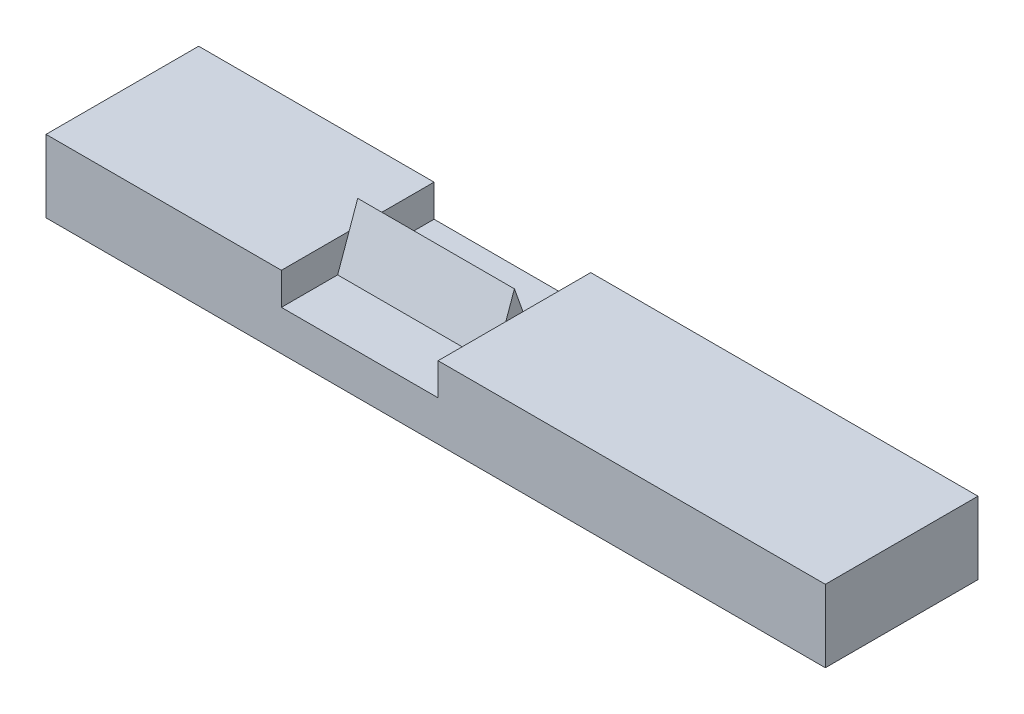
ISO-10303-21;
HEADER;
FILE_DESCRIPTION(('STEP AP214'),'2;1');
FILE_NAME('part.step','',(''),(''),'','','');
FILE_SCHEMA(('AUTOMOTIVE_DESIGN { 1 0 10303 214 1 1 1 1 }'));
ENDSEC;
DATA;
#1=APPLICATION_CONTEXT('core data for automotive mechanical design processes');
#2=APPLICATION_PROTOCOL_DEFINITION('international standard','automotive_design',2000,#1);
#3=PRODUCT_CONTEXT('',#1,'mechanical');
#4=PRODUCT('Part','Part','',(#3));
#5=PRODUCT_RELATED_PRODUCT_CATEGORY('part','',(#4));
#6=PRODUCT_DEFINITION_FORMATION('','',#4);
#7=PRODUCT_DEFINITION_CONTEXT('part definition',#1,'design');
#8=PRODUCT_DEFINITION('design','',#6,#7);
#9=PRODUCT_DEFINITION_SHAPE('','',#8);
#10=(LENGTH_UNIT() NAMED_UNIT(*) SI_UNIT(.MILLI.,.METRE.));
#11=(NAMED_UNIT(*) PLANE_ANGLE_UNIT() SI_UNIT($,.RADIAN.));
#12=(NAMED_UNIT(*) SI_UNIT($,.STERADIAN.) SOLID_ANGLE_UNIT());
#13=UNCERTAINTY_MEASURE_WITH_UNIT(LENGTH_MEASURE(1.E-05),#10,'distance_accuracy_value','');
#14=(GEOMETRIC_REPRESENTATION_CONTEXT(3) GLOBAL_UNCERTAINTY_ASSIGNED_CONTEXT((#13)) GLOBAL_UNIT_ASSIGNED_CONTEXT((#10,
#11,#12)) REPRESENTATION_CONTEXT('',''));
#15=CARTESIAN_POINT('',(0.,0.,0.));
#16=DIRECTION('',(0.,0.,1.));
#17=DIRECTION('',(1.,0.,0.));
#18=AXIS2_PLACEMENT_3D('',#15,#16,#17);
#19=CARTESIAN_POINT('',(0.299999999999998,-5.,9.5));
#20=DIRECTION('',(1.,0.,0.));
#21=DIRECTION('',(0.,0.,-1.));
#22=AXIS2_PLACEMENT_3D('',#19,#20,#21);
#23=PLANE('',#22);
#24=DIRECTION('',(0.,0.,1.));
#25=VECTOR('',#24,1.);
#26=CARTESIAN_POINT('',(0.299999999999998,-1.,-9.5));
#27=LINE('',#26,#25);
#28=CARTESIAN_POINT('',(0.299999999999998,-1.,-9.5));
#29=VERTEX_POINT('',#28);
#30=CARTESIAN_POINT('',(0.299999999999998,-1.,-1.07142857142857));
#31=VERTEX_POINT('',#30);
#32=EDGE_CURVE('E251',#29,#31,#27,.T.);
#33=ORIENTED_EDGE('',*,*,#32,.F.);
#34=DIRECTION('',(0.,1.,0.));
#35=VECTOR('',#34,1.);
#36=CARTESIAN_POINT('',(0.299999999999998,-5.,-9.5));
#37=LINE('',#36,#35);
#38=CARTESIAN_POINT('',(0.299999999999998,-5.,-9.5));
#39=VERTEX_POINT('',#38);
#40=EDGE_CURVE('E214',#39,#29,#37,.T.);
#41=ORIENTED_EDGE('',*,*,#40,.F.);
#42=DIRECTION('',(0.,0.,-1.));
#43=VECTOR('',#42,1.);
#44=CARTESIAN_POINT('',(0.299999999999998,-5.,9.5));
#45=LINE('',#44,#43);
#46=CARTESIAN_POINT('',(0.299999999999998,-5.,-2.5));
#47=VERTEX_POINT('',#46);
#48=EDGE_CURVE('E201',#47,#39,#45,.T.);
#49=ORIENTED_EDGE('',*,*,#48,.F.);
#50=DIRECTION('',(0.,0.941741911594837,0.336336396998156));
#51=VECTOR('',#50,1.);
#52=CARTESIAN_POINT('',(0.299999999999998,-1.19909502262443,-1.14253393665158));
#53=LINE('',#52,#51);
#54=EDGE_CURVE('E198',#47,#31,#53,.T.);
#55=ORIENTED_EDGE('',*,*,#54,.T.);
#56=EDGE_LOOP('',(#33,#41,#49,#55));
#57=FACE_BOUND('',#56,.T.);
#58=ADVANCED_FACE('F32',(#57),#23,.F.);
#59=CARTESIAN_POINT('',(-19.2,-5.,9.5));
#60=DIRECTION('',(-1.,0.,0.));
#61=DIRECTION('',(0.,0.,1.));
#62=AXIS2_PLACEMENT_3D('',#59,#60,#61);
#63=PLANE('',#62);
#64=DIRECTION('',(0.,0.,-1.));
#65=VECTOR('',#64,1.);
#66=CARTESIAN_POINT('',(-19.2,-1.,-9.5));
#67=LINE('',#66,#65);
#68=CARTESIAN_POINT('',(-19.2,-1.,-1.07142857142857));
#69=VERTEX_POINT('',#68);
#70=CARTESIAN_POINT('',(-19.2,-1.,-9.5));
#71=VERTEX_POINT('',#70);
#72=EDGE_CURVE('E150',#69,#71,#67,.T.);
#73=ORIENTED_EDGE('',*,*,#72,.F.);
#74=DIRECTION('',(0.,-0.941741911594837,-0.336336396998156));
#75=VECTOR('',#74,1.);
#76=CARTESIAN_POINT('',(-19.2,-1.19909502262443,-1.14253393665158));
#77=LINE('',#76,#75);
#78=CARTESIAN_POINT('',(-19.2,-5.,-2.5));
#79=VERTEX_POINT('',#78);
#80=EDGE_CURVE('E196',#69,#79,#77,.T.);
#81=ORIENTED_EDGE('',*,*,#80,.T.);
#82=DIRECTION('',(0.,0.,1.));
#83=VECTOR('',#82,1.);
#84=CARTESIAN_POINT('',(-19.2,-5.,9.5));
#85=LINE('',#84,#83);
#86=CARTESIAN_POINT('',(-19.2,-5.,-9.5));
#87=VERTEX_POINT('',#86);
#88=EDGE_CURVE('E208',#87,#79,#85,.T.);
#89=ORIENTED_EDGE('',*,*,#88,.F.);
#90=DIRECTION('',(0.,1.,0.));
#91=VECTOR('',#90,1.);
#92=CARTESIAN_POINT('',(-19.2,-5.,-9.5));
#93=LINE('',#92,#91);
#94=EDGE_CURVE('E220',#87,#71,#93,.T.);
#95=ORIENTED_EDGE('',*,*,#94,.T.);
#96=EDGE_LOOP('',(#73,#81,#89,#95));
#97=FACE_BOUND('',#96,.T.);
#98=ADVANCED_FACE('F268',(#97),#63,.F.);
#99=CARTESIAN_POINT('',(48.5,-10.,9.5));
#100=DIRECTION('',(1.,0.,0.));
#101=DIRECTION('',(0.,0.,-1.));
#102=AXIS2_PLACEMENT_3D('',#99,#100,#101);
#103=PLANE('',#102);
#104=DIRECTION('',(0.,1.,0.));
#105=VECTOR('',#104,1.);
#106=CARTESIAN_POINT('',(48.5,-10.,-9.5));
#107=LINE('',#106,#105);
#108=CARTESIAN_POINT('',(48.5,-10.,-9.5));
#109=VERTEX_POINT('',#108);
#110=CARTESIAN_POINT('',(48.5,-1.,-9.5));
#111=VERTEX_POINT('',#110);
#112=EDGE_CURVE('E160',#109,#111,#107,.T.);
#113=ORIENTED_EDGE('',*,*,#112,.T.);
#114=DIRECTION('',(0.,0.,-1.));
#115=VECTOR('',#114,1.);
#116=CARTESIAN_POINT('',(48.5,-1.,-9.5));
#117=LINE('',#116,#115);
#118=CARTESIAN_POINT('',(48.5,-1.,9.5));
#119=VERTEX_POINT('',#118);
#120=EDGE_CURVE('E233',#119,#111,#117,.T.);
#121=ORIENTED_EDGE('',*,*,#120,.F.);
#122=DIRECTION('',(0.,1.,0.));
#123=VECTOR('',#122,1.);
#124=CARTESIAN_POINT('',(48.5,-10.,9.5));
#125=LINE('',#124,#123);
#126=CARTESIAN_POINT('',(48.5,-10.,9.5));
#127=VERTEX_POINT('',#126);
#128=EDGE_CURVE('E55',#127,#119,#125,.T.);
#129=ORIENTED_EDGE('',*,*,#128,.F.);
#130=DIRECTION('',(0.,0.,-1.));
#131=VECTOR('',#130,1.);
#132=CARTESIAN_POINT('',(48.5,-10.,9.5));
#133=LINE('',#132,#131);
#134=EDGE_CURVE('E218',#127,#109,#133,.T.);
#135=ORIENTED_EDGE('',*,*,#134,.T.);
#136=EDGE_LOOP('',(#113,#121,#129,#135));
#137=FACE_BOUND('',#136,.T.);
#138=ADVANCED_FACE('F34',(#137),#103,.T.);
#139=CARTESIAN_POINT('',(-48.5,-10.,9.5));
#140=DIRECTION('',(0.,0.,1.));
#141=DIRECTION('',(1.,0.,0.));
#142=AXIS2_PLACEMENT_3D('',#139,#140,#141);
#143=PLANE('',#142);
#144=DIRECTION('',(0.,1.,0.));
#145=VECTOR('',#144,1.);
#146=CARTESIAN_POINT('',(-19.2,-5.,9.5));
#147=LINE('',#146,#145);
#148=CARTESIAN_POINT('',(-19.2,-5.,9.5));
#149=VERTEX_POINT('',#148);
#150=CARTESIAN_POINT('',(-19.2,-1.,9.5));
#151=VERTEX_POINT('',#150);
#152=EDGE_CURVE('E149',#149,#151,#147,.T.);
#153=ORIENTED_EDGE('',*,*,#152,.T.);
#154=DIRECTION('',(1.,0.,0.));
#155=VECTOR('',#154,1.);
#156=CARTESIAN_POINT('',(-48.5,-1.,9.5));
#157=LINE('',#156,#155);
#158=CARTESIAN_POINT('',(-48.5,-1.,9.5));
#159=VERTEX_POINT('',#158);
#160=EDGE_CURVE('E132',#159,#151,#157,.T.);
#161=ORIENTED_EDGE('',*,*,#160,.F.);
#162=DIRECTION('',(0.,1.,0.));
#163=VECTOR('',#162,1.);
#164=CARTESIAN_POINT('',(-48.5,-10.,9.5));
#165=LINE('',#164,#163);
#166=CARTESIAN_POINT('',(-48.5,-10.,9.5));
#167=VERTEX_POINT('',#166);
#168=EDGE_CURVE('E145',#167,#159,#165,.T.);
#169=ORIENTED_EDGE('',*,*,#168,.F.);
#170=DIRECTION('',(1.,0.,0.));
#171=VECTOR('',#170,1.);
#172=CARTESIAN_POINT('',(-48.5,-10.,9.5));
#173=LINE('',#172,#171);
#174=EDGE_CURVE('E166',#167,#127,#173,.T.);
#175=ORIENTED_EDGE('',*,*,#174,.T.);
#176=ORIENTED_EDGE('',*,*,#128,.T.);
#177=DIRECTION('',(1.,0.,0.));
#178=VECTOR('',#177,1.);
#179=CARTESIAN_POINT('',(0.299999999999998,-1.,9.5));
#180=LINE('',#179,#178);
#181=CARTESIAN_POINT('',(0.299999999999998,-1.,9.5));
#182=VERTEX_POINT('',#181);
#183=EDGE_CURVE('E243',#182,#119,#180,.T.);
#184=ORIENTED_EDGE('',*,*,#183,.F.);
#185=DIRECTION('',(0.,1.,0.));
#186=VECTOR('',#185,1.);
#187=CARTESIAN_POINT('',(0.299999999999998,-5.,9.5));
#188=LINE('',#187,#186);
#189=CARTESIAN_POINT('',(0.299999999999998,-5.,9.5));
#190=VERTEX_POINT('',#189);
#191=EDGE_CURVE('E215',#190,#182,#188,.T.);
#192=ORIENTED_EDGE('',*,*,#191,.F.);
#193=DIRECTION('',(1.,0.,0.));
#194=VECTOR('',#193,1.);
#195=CARTESIAN_POINT('',(-19.2,-5.,9.5));
#196=LINE('',#195,#194);
#197=EDGE_CURVE('E211',#149,#190,#196,.T.);
#198=ORIENTED_EDGE('',*,*,#197,.F.);
#199=EDGE_LOOP('',(#153,#161,#169,#175,#176,#184,#192,#198));
#200=FACE_BOUND('',#199,.T.);
#201=ADVANCED_FACE('F143',(#200),#143,.T.);
#202=CARTESIAN_POINT('',(-48.5,-10.,9.5));
#203=DIRECTION('',(-1.,0.,0.));
#204=DIRECTION('',(0.,0.,1.));
#205=AXIS2_PLACEMENT_3D('',#202,#203,#204);
#206=PLANE('',#205);
#207=ORIENTED_EDGE('',*,*,#168,.T.);
#208=DIRECTION('',(0.,0.,1.));
#209=VECTOR('',#208,1.);
#210=CARTESIAN_POINT('',(-48.5,-1.,-9.5));
#211=LINE('',#210,#209);
#212=CARTESIAN_POINT('',(-48.5,-1.,-9.5));
#213=VERTEX_POINT('',#212);
#214=EDGE_CURVE('E128',#213,#159,#211,.T.);
#215=ORIENTED_EDGE('',*,*,#214,.F.);
#216=DIRECTION('',(0.,1.,0.));
#217=VECTOR('',#216,1.);
#218=CARTESIAN_POINT('',(-48.5,-10.,-9.5));
#219=LINE('',#218,#217);
#220=CARTESIAN_POINT('',(-48.5,-10.,-9.5));
#221=VERTEX_POINT('',#220);
#222=EDGE_CURVE('E156',#221,#213,#219,.T.);
#223=ORIENTED_EDGE('',*,*,#222,.F.);
#224=DIRECTION('',(0.,0.,1.));
#225=VECTOR('',#224,1.);
#226=CARTESIAN_POINT('',(-48.5,-10.,9.5));
#227=LINE('',#226,#225);
#228=EDGE_CURVE('E154',#221,#167,#227,.T.);
#229=ORIENTED_EDGE('',*,*,#228,.T.);
#230=EDGE_LOOP('',(#207,#215,#223,#229));
#231=FACE_BOUND('',#230,.T.);
#232=ADVANCED_FACE('F152',(#231),#206,.T.);
#233=CARTESIAN_POINT('',(-48.5,-10.,-9.5));
#234=DIRECTION('',(0.,0.,-1.));
#235=DIRECTION('',(-1.,0.,0.));
#236=AXIS2_PLACEMENT_3D('',#233,#234,#235);
#237=PLANE('',#236);
#238=ORIENTED_EDGE('',*,*,#222,.T.);
#239=DIRECTION('',(-1.,0.,0.));
#240=VECTOR('',#239,1.);
#241=CARTESIAN_POINT('',(-48.5,-1.,-9.5));
#242=LINE('',#241,#240);
#243=EDGE_CURVE('E135',#71,#213,#242,.T.);
#244=ORIENTED_EDGE('',*,*,#243,.F.);
#245=ORIENTED_EDGE('',*,*,#94,.F.);
#246=DIRECTION('',(-1.,0.,0.));
#247=VECTOR('',#246,1.);
#248=CARTESIAN_POINT('',(-19.2,-5.,-9.5));
#249=LINE('',#248,#247);
#250=EDGE_CURVE('E205',#39,#87,#249,.T.);
#251=ORIENTED_EDGE('',*,*,#250,.F.);
#252=ORIENTED_EDGE('',*,*,#40,.T.);
#253=DIRECTION('',(-1.,0.,0.));
#254=VECTOR('',#253,1.);
#255=CARTESIAN_POINT('',(0.299999999999998,-1.,-9.5));
#256=LINE('',#255,#254);
#257=EDGE_CURVE('E139',#111,#29,#256,.T.);
#258=ORIENTED_EDGE('',*,*,#257,.F.);
#259=ORIENTED_EDGE('',*,*,#112,.F.);
#260=DIRECTION('',(-1.,0.,0.));
#261=VECTOR('',#260,1.);
#262=CARTESIAN_POINT('',(-48.5,-10.,-9.5));
#263=LINE('',#262,#261);
#264=EDGE_CURVE('E226',#109,#221,#263,.T.);
#265=ORIENTED_EDGE('',*,*,#264,.T.);
#266=EDGE_LOOP('',(#238,#244,#245,#251,#252,#258,#259,#265));
#267=FACE_BOUND('',#266,.T.);
#268=ADVANCED_FACE('F236',(#267),#237,.T.);
#269=DIRECTION('',(0.,0.,1.));
#270=VECTOR('',#269,1.);
#271=CARTESIAN_POINT('',(0.299999999999998,-1.,9.5));
#272=LINE('',#271,#270);
#273=CARTESIAN_POINT('',(0.299999999999998,-1.,1.07142857142857));
#274=VERTEX_POINT('',#273);
#275=EDGE_CURVE('E11',#274,#182,#272,.T.);
#276=ORIENTED_EDGE('',*,*,#275,.F.);
#277=DIRECTION('',(0.,-0.941741911594837,0.336336396998156));
#278=VECTOR('',#277,1.);
#279=CARTESIAN_POINT('',(0.299999999999998,-7.21719457013575,3.29185520361991));
#280=LINE('',#279,#278);
#281=CARTESIAN_POINT('',(0.299999999999998,-5.,2.5));
#282=VERTEX_POINT('',#281);
#283=EDGE_CURVE('E188',#274,#282,#280,.T.);
#284=ORIENTED_EDGE('',*,*,#283,.T.);
#285=EDGE_CURVE('E202',#190,#282,#45,.T.);
#286=ORIENTED_EDGE('',*,*,#285,.F.);
#287=ORIENTED_EDGE('',*,*,#191,.T.);
#288=EDGE_LOOP('',(#276,#284,#286,#287));
#289=FACE_BOUND('',#288,.T.);
#290=ADVANCED_FACE('F258',(#289),#23,.F.);
#291=CARTESIAN_POINT('',(-19.2,-1.,1.07142857142857));
#292=VERTEX_POINT('',#291);
#293=EDGE_CURVE('E182',#151,#292,#67,.T.);
#294=ORIENTED_EDGE('',*,*,#293,.F.);
#295=ORIENTED_EDGE('',*,*,#152,.F.);
#296=CARTESIAN_POINT('',(-19.2,-5.,2.5));
#297=VERTEX_POINT('',#296);
#298=EDGE_CURVE('E187',#297,#149,#85,.T.);
#299=ORIENTED_EDGE('',*,*,#298,.F.);
#300=DIRECTION('',(0.,0.941741911594837,-0.336336396998156));
#301=VECTOR('',#300,1.);
#302=CARTESIAN_POINT('',(-19.2,-7.21719457013575,3.29185520361991));
#303=LINE('',#302,#301);
#304=EDGE_CURVE('E47',#297,#292,#303,.T.);
#305=ORIENTED_EDGE('',*,*,#304,.T.);
#306=EDGE_LOOP('',(#294,#295,#299,#305));
#307=FACE_BOUND('',#306,.T.);
#308=ADVANCED_FACE('F186',(#307),#63,.F.);
#309=CARTESIAN_POINT('',(29.8,-5.,-2.5));
#310=DIRECTION('',(0.,0.336336396998156,-0.941741911594837));
#311=DIRECTION('',(0.,0.941741911594837,0.336336396998156));
#312=AXIS2_PLACEMENT_3D('',#309,#310,#311);
#313=PLANE('',#312);
#314=CARTESIAN_POINT('',(-19.2,2.,0.));
#315=VERTEX_POINT('',#314);
#316=EDGE_CURVE('E180',#315,#69,#77,.T.);
#317=ORIENTED_EDGE('',*,*,#316,.F.);
#318=DIRECTION('',(-1.,0.,0.));
#319=VECTOR('',#318,1.);
#320=CARTESIAN_POINT('',(29.8,2.,0.));
#321=LINE('',#320,#319);
#322=CARTESIAN_POINT('',(0.299999999999999,2.,0.));
#323=VERTEX_POINT('',#322);
#324=EDGE_CURVE('E175',#323,#315,#321,.T.);
#325=ORIENTED_EDGE('',*,*,#324,.F.);
#326=DIRECTION('',(0.,-0.941741911594837,-0.336336396998156));
#327=VECTOR('',#326,1.);
#328=CARTESIAN_POINT('',(0.299999999999998,-5.,-2.5));
#329=LINE('',#328,#327);
#330=EDGE_CURVE('E192',#323,#31,#329,.T.);
#331=ORIENTED_EDGE('',*,*,#330,.T.);
#332=ORIENTED_EDGE('',*,*,#54,.F.);
#333=DIRECTION('',(1.,0.,0.));
#334=VECTOR('',#333,1.);
#335=CARTESIAN_POINT('',(0.,-5.,-2.5));
#336=LINE('',#335,#334);
#337=EDGE_CURVE('E168',#79,#47,#336,.T.);
#338=ORIENTED_EDGE('',*,*,#337,.F.);
#339=ORIENTED_EDGE('',*,*,#80,.F.);
#340=EDGE_LOOP('',(#317,#325,#331,#332,#338,#339));
#341=FACE_BOUND('',#340,.T.);
#342=ADVANCED_FACE('F264',(#341),#313,.T.);
#343=CARTESIAN_POINT('',(29.8,2.,0.));
#344=DIRECTION('',(0.,0.336336396998156,0.941741911594837));
#345=DIRECTION('',(0.,-0.941741911594837,0.336336396998156));
#346=AXIS2_PLACEMENT_3D('',#343,#344,#345);
#347=PLANE('',#346);
#348=ORIENTED_EDGE('',*,*,#324,.T.);
#349=DIRECTION('',(0.,-0.941741911594837,0.336336396998156));
#350=VECTOR('',#349,1.);
#351=CARTESIAN_POINT('',(-19.2,2.,0.));
#352=LINE('',#351,#350);
#353=EDGE_CURVE('E40',#315,#292,#352,.T.);
#354=ORIENTED_EDGE('',*,*,#353,.T.);
#355=ORIENTED_EDGE('',*,*,#304,.F.);
#356=DIRECTION('',(-1.,0.,0.));
#357=VECTOR('',#356,1.);
#358=CARTESIAN_POINT('',(0.,-5.,2.5));
#359=LINE('',#358,#357);
#360=EDGE_CURVE('E158',#282,#297,#359,.T.);
#361=ORIENTED_EDGE('',*,*,#360,.F.);
#362=ORIENTED_EDGE('',*,*,#283,.F.);
#363=EDGE_CURVE('E190',#323,#274,#280,.T.);
#364=ORIENTED_EDGE('',*,*,#363,.F.);
#365=EDGE_LOOP('',(#348,#354,#355,#361,#362,#364));
#366=FACE_BOUND('',#365,.T.);
#367=ADVANCED_FACE('F173',(#366),#347,.T.);
#368=CARTESIAN_POINT('',(0.,-5.,0.));
#369=DIRECTION('',(0.,-1.,0.));
#370=DIRECTION('',(0.,0.,-1.));
#371=AXIS2_PLACEMENT_3D('',#368,#369,#370);
#372=PLANE('',#371);
#373=ORIENTED_EDGE('',*,*,#88,.T.);
#374=ORIENTED_EDGE('',*,*,#337,.T.);
#375=ORIENTED_EDGE('',*,*,#48,.T.);
#376=ORIENTED_EDGE('',*,*,#250,.T.);
#377=EDGE_LOOP('',(#373,#374,#375,#376));
#378=FACE_BOUND('',#377,.T.);
#379=ADVANCED_FACE('F271',(#378),#372,.F.);
#380=CARTESIAN_POINT('',(0.,-10.,0.));
#381=DIRECTION('',(0.,-1.,0.));
#382=DIRECTION('',(0.,0.,-1.));
#383=AXIS2_PLACEMENT_3D('',#380,#381,#382);
#384=PLANE('',#383);
#385=ORIENTED_EDGE('',*,*,#134,.F.);
#386=ORIENTED_EDGE('',*,*,#174,.F.);
#387=ORIENTED_EDGE('',*,*,#228,.F.);
#388=ORIENTED_EDGE('',*,*,#264,.F.);
#389=EDGE_LOOP('',(#385,#386,#387,#388));
#390=FACE_BOUND('',#389,.T.);
#391=ADVANCED_FACE('F231',(#390),#384,.T.);
#392=ORIENTED_EDGE('',*,*,#285,.T.);
#393=ORIENTED_EDGE('',*,*,#360,.T.);
#394=ORIENTED_EDGE('',*,*,#298,.T.);
#395=ORIENTED_EDGE('',*,*,#197,.T.);
#396=EDGE_LOOP('',(#392,#393,#394,#395));
#397=FACE_BOUND('',#396,.T.);
#398=ADVANCED_FACE('F261',(#397),#372,.F.);
#399=CARTESIAN_POINT('',(0.299999999999998,2.,-9.5));
#400=DIRECTION('',(1.,0.,0.));
#401=DIRECTION('',(0.,0.,-1.));
#402=AXIS2_PLACEMENT_3D('',#399,#400,#401);
#403=PLANE('',#402);
#404=ORIENTED_EDGE('',*,*,#330,.F.);
#405=ORIENTED_EDGE('',*,*,#363,.T.);
#406=EDGE_CURVE('E252',#31,#274,#27,.T.);
#407=ORIENTED_EDGE('',*,*,#406,.F.);
#408=EDGE_LOOP('',(#404,#405,#407));
#409=FACE_BOUND('',#408,.T.);
#410=ADVANCED_FACE('F263',(#409),#403,.T.);
#411=CARTESIAN_POINT('',(-19.2,2.,-9.5));
#412=DIRECTION('',(-1.,0.,0.));
#413=DIRECTION('',(0.,0.,1.));
#414=AXIS2_PLACEMENT_3D('',#411,#412,#413);
#415=PLANE('',#414);
#416=ORIENTED_EDGE('',*,*,#353,.F.);
#417=ORIENTED_EDGE('',*,*,#316,.T.);
#418=EDGE_CURVE('E178',#292,#69,#67,.T.);
#419=ORIENTED_EDGE('',*,*,#418,.F.);
#420=EDGE_LOOP('',(#416,#417,#419));
#421=FACE_BOUND('',#420,.T.);
#422=ADVANCED_FACE('F179',(#421),#415,.T.);
#423=CARTESIAN_POINT('',(0.,-1.,0.));
#424=DIRECTION('',(0.,1.,0.));
#425=DIRECTION('',(0.,0.,1.));
#426=AXIS2_PLACEMENT_3D('',#423,#424,#425);
#427=PLANE('',#426);
#428=ORIENTED_EDGE('',*,*,#214,.T.);
#429=ORIENTED_EDGE('',*,*,#160,.T.);
#430=ORIENTED_EDGE('',*,*,#293,.T.);
#431=ORIENTED_EDGE('',*,*,#418,.T.);
#432=ORIENTED_EDGE('',*,*,#72,.T.);
#433=ORIENTED_EDGE('',*,*,#243,.T.);
#434=EDGE_LOOP('',(#428,#429,#430,#431,#432,#433));
#435=FACE_BOUND('',#434,.T.);
#436=ADVANCED_FACE('F130',(#435),#427,.T.);
#437=CARTESIAN_POINT('',(0.,-1.,0.));
#438=DIRECTION('',(0.,1.,0.));
#439=DIRECTION('',(0.,0.,1.));
#440=AXIS2_PLACEMENT_3D('',#437,#438,#439);
#441=PLANE('',#440);
#442=ORIENTED_EDGE('',*,*,#32,.T.);
#443=ORIENTED_EDGE('',*,*,#406,.T.);
#444=ORIENTED_EDGE('',*,*,#275,.T.);
#445=ORIENTED_EDGE('',*,*,#183,.T.);
#446=ORIENTED_EDGE('',*,*,#120,.T.);
#447=ORIENTED_EDGE('',*,*,#257,.T.);
#448=EDGE_LOOP('',(#442,#443,#444,#445,#446,#447));
#449=FACE_BOUND('',#448,.T.);
#450=ADVANCED_FACE('F253',(#449),#441,.T.);
#451=CLOSED_SHELL('',(#58,#98,#138,#201,#232,#268,#290,#308,#342,#367,#379,#391,#398,#410,#422,
#436,#450));
#452=MANIFOLD_SOLID_BREP('B2',#451);
#453=ADVANCED_BREP_SHAPE_REPRESENTATION('',(#18,#452),#14);
#454=SHAPE_DEFINITION_REPRESENTATION(#9,#453);
ENDSEC;
END-ISO-10303-21;
